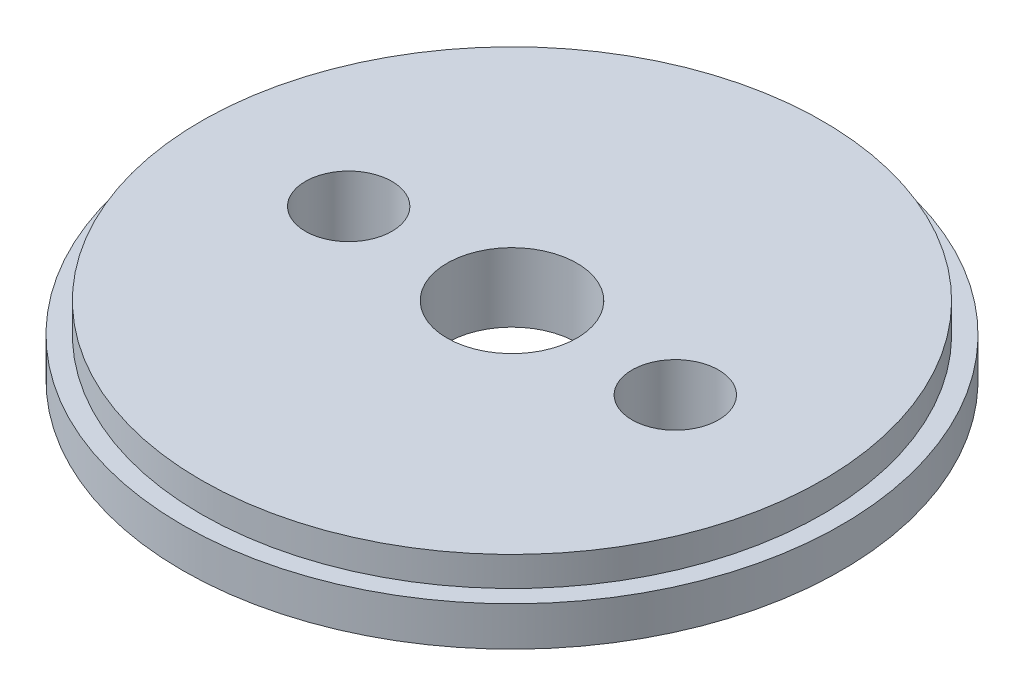
ISO-10303-21;
HEADER;
FILE_DESCRIPTION(('STEP AP214'),'2;1');
FILE_NAME('part.step','',(''),(''),'','','');
FILE_SCHEMA(('AUTOMOTIVE_DESIGN { 1 0 10303 214 1 1 1 1 }'));
ENDSEC;
DATA;
#1=APPLICATION_CONTEXT('core data for automotive mechanical design processes');
#2=APPLICATION_PROTOCOL_DEFINITION('international standard','automotive_design',2000,#1);
#3=PRODUCT_CONTEXT('',#1,'mechanical');
#4=PRODUCT('Part','Part','',(#3));
#5=PRODUCT_RELATED_PRODUCT_CATEGORY('part','',(#4));
#6=PRODUCT_DEFINITION_FORMATION('','',#4);
#7=PRODUCT_DEFINITION_CONTEXT('part definition',#1,'design');
#8=PRODUCT_DEFINITION('design','',#6,#7);
#9=PRODUCT_DEFINITION_SHAPE('','',#8);
#10=(LENGTH_UNIT() NAMED_UNIT(*) SI_UNIT(.MILLI.,.METRE.));
#11=(NAMED_UNIT(*) PLANE_ANGLE_UNIT() SI_UNIT($,.RADIAN.));
#12=(NAMED_UNIT(*) SI_UNIT($,.STERADIAN.) SOLID_ANGLE_UNIT());
#13=UNCERTAINTY_MEASURE_WITH_UNIT(LENGTH_MEASURE(1.E-05),#10,'distance_accuracy_value','');
#14=(GEOMETRIC_REPRESENTATION_CONTEXT(3) GLOBAL_UNCERTAINTY_ASSIGNED_CONTEXT((#13)) GLOBAL_UNIT_ASSIGNED_CONTEXT((#10,
#11,#12)) REPRESENTATION_CONTEXT('',''));
#15=CARTESIAN_POINT('',(0.,0.,0.));
#16=DIRECTION('',(0.,0.,1.));
#17=DIRECTION('',(1.,0.,0.));
#18=AXIS2_PLACEMENT_3D('',#15,#16,#17);
#19=CARTESIAN_POINT('',(0.,0.,0.));
#20=DIRECTION('',(0.,1.,0.));
#21=DIRECTION('',(0.,0.,1.));
#22=AXIS2_PLACEMENT_3D('',#19,#20,#21);
#23=PLANE('',#22);
#24=CARTESIAN_POINT('',(0.,0.,0.));
#25=DIRECTION('',(0.,1.,0.));
#26=DIRECTION('',(0.,0.,1.));
#27=AXIS2_PLACEMENT_3D('',#24,#25,#26);
#28=CIRCLE('',#27,3.3);
#29=CARTESIAN_POINT('',(0.,0.,3.3));
#30=VERTEX_POINT('',#29);
#31=EDGE_CURVE('E60',#30,#30,#28,.T.);
#32=ORIENTED_EDGE('',*,*,#31,.T.);
#33=EDGE_LOOP('',(#32));
#34=FACE_BOUND('',#33,.T.);
#35=CARTESIAN_POINT('',(8.30000000000001,0.,0.));
#36=DIRECTION('',(0.,1.,0.));
#37=DIRECTION('',(0.,0.,1.));
#38=AXIS2_PLACEMENT_3D('',#35,#36,#37);
#39=CIRCLE('',#38,2.2);
#40=CARTESIAN_POINT('',(8.30000000000001,0.,2.2));
#41=VERTEX_POINT('',#40);
#42=EDGE_CURVE('E54',#41,#41,#39,.F.);
#43=ORIENTED_EDGE('',*,*,#42,.F.);
#44=EDGE_LOOP('',(#43));
#45=FACE_BOUND('',#44,.T.);
#46=CARTESIAN_POINT('',(0.,0.,0.));
#47=DIRECTION('',(0.,1.,0.));
#48=DIRECTION('',(0.,0.,1.));
#49=AXIS2_PLACEMENT_3D('',#46,#47,#48);
#50=CIRCLE('',#49,16.75);
#51=CARTESIAN_POINT('',(0.,0.,16.75));
#52=VERTEX_POINT('',#51);
#53=EDGE_CURVE('E11',#52,#52,#50,.T.);
#54=ORIENTED_EDGE('',*,*,#53,.F.);
#55=EDGE_LOOP('',(#54));
#56=FACE_BOUND('',#55,.T.);
#57=CARTESIAN_POINT('',(-8.3,0.,0.));
#58=DIRECTION('',(0.,1.,0.));
#59=DIRECTION('',(0.,0.,1.));
#60=AXIS2_PLACEMENT_3D('',#57,#58,#59);
#61=CIRCLE('',#60,2.2);
#62=CARTESIAN_POINT('',(-8.3,0.,2.2));
#63=VERTEX_POINT('',#62);
#64=EDGE_CURVE('E48',#63,#63,#61,.T.);
#65=ORIENTED_EDGE('',*,*,#64,.T.);
#66=EDGE_LOOP('',(#65));
#67=FACE_BOUND('',#66,.T.);
#68=ADVANCED_FACE('F32',(#34,#45,#56,#67),#23,.F.);
#69=CARTESIAN_POINT('',(0.,3.5,0.));
#70=DIRECTION('',(0.,1.,0.));
#71=DIRECTION('',(0.,0.,1.));
#72=AXIS2_PLACEMENT_3D('',#69,#70,#71);
#73=PLANE('',#72);
#74=CARTESIAN_POINT('',(8.30000000000001,3.5,0.));
#75=DIRECTION('',(0.,1.,0.));
#76=DIRECTION('',(0.,0.,1.));
#77=AXIS2_PLACEMENT_3D('',#74,#75,#76);
#78=CIRCLE('',#77,2.2);
#79=CARTESIAN_POINT('',(8.30000000000001,3.5,2.2));
#80=VERTEX_POINT('',#79);
#81=EDGE_CURVE('E51',#80,#80,#78,.F.);
#82=ORIENTED_EDGE('',*,*,#81,.T.);
#83=EDGE_LOOP('',(#82));
#84=FACE_BOUND('',#83,.T.);
#85=CARTESIAN_POINT('',(0.,3.5,0.));
#86=DIRECTION('',(0.,1.,0.));
#87=DIRECTION('',(0.,0.,1.));
#88=AXIS2_PLACEMENT_3D('',#85,#86,#87);
#89=CIRCLE('',#88,15.8);
#90=CARTESIAN_POINT('',(0.,3.5,15.8));
#91=VERTEX_POINT('',#90);
#92=EDGE_CURVE('E45',#91,#91,#89,.T.);
#93=ORIENTED_EDGE('',*,*,#92,.T.);
#94=EDGE_LOOP('',(#93));
#95=FACE_BOUND('',#94,.T.);
#96=CARTESIAN_POINT('',(0.,3.5,0.));
#97=DIRECTION('',(0.,1.,0.));
#98=DIRECTION('',(0.,0.,1.));
#99=AXIS2_PLACEMENT_3D('',#96,#97,#98);
#100=CIRCLE('',#99,3.3);
#101=CARTESIAN_POINT('',(0.,3.5,3.3));
#102=VERTEX_POINT('',#101);
#103=EDGE_CURVE('E57',#102,#102,#100,.T.);
#104=ORIENTED_EDGE('',*,*,#103,.F.);
#105=EDGE_LOOP('',(#104));
#106=FACE_BOUND('',#105,.T.);
#107=CARTESIAN_POINT('',(-8.3,3.5,0.));
#108=DIRECTION('',(0.,1.,0.));
#109=DIRECTION('',(0.,0.,1.));
#110=AXIS2_PLACEMENT_3D('',#107,#108,#109);
#111=CIRCLE('',#110,2.2);
#112=CARTESIAN_POINT('',(-8.3,3.5,2.2));
#113=VERTEX_POINT('',#112);
#114=EDGE_CURVE('E63',#113,#113,#111,.T.);
#115=ORIENTED_EDGE('',*,*,#114,.F.);
#116=EDGE_LOOP('',(#115));
#117=FACE_BOUND('',#116,.T.);
#118=ADVANCED_FACE('F77',(#84,#95,#106,#117),#73,.T.);
#119=CARTESIAN_POINT('',(0.,3.5,0.));
#120=DIRECTION('',(0.,-1.,0.));
#121=DIRECTION('',(0.,0.,-1.));
#122=AXIS2_PLACEMENT_3D('',#119,#120,#121);
#123=CYLINDRICAL_SURFACE('',#122,16.75);
#124=ORIENTED_EDGE('',*,*,#53,.T.);
#125=EDGE_LOOP('',(#124));
#126=FACE_BOUND('',#125,.T.);
#127=CARTESIAN_POINT('',(0.,2.,0.));
#128=DIRECTION('',(0.,1.,0.));
#129=DIRECTION('',(0.,0.,1.));
#130=AXIS2_PLACEMENT_3D('',#127,#128,#129);
#131=CIRCLE('',#130,16.75);
#132=CARTESIAN_POINT('',(0.,2.,16.75));
#133=VERTEX_POINT('',#132);
#134=EDGE_CURVE('E36',#133,#133,#131,.T.);
#135=ORIENTED_EDGE('',*,*,#134,.F.);
#136=EDGE_LOOP('',(#135));
#137=FACE_BOUND('',#136,.T.);
#138=ADVANCED_FACE('F34',(#126,#137),#123,.T.);
#139=CARTESIAN_POINT('',(0.,2.,0.));
#140=DIRECTION('',(0.,1.,0.));
#141=DIRECTION('',(0.,0.,1.));
#142=AXIS2_PLACEMENT_3D('',#139,#140,#141);
#143=PLANE('',#142);
#144=CARTESIAN_POINT('',(0.,2.,0.));
#145=DIRECTION('',(0.,1.,0.));
#146=DIRECTION('',(0.,0.,1.));
#147=AXIS2_PLACEMENT_3D('',#144,#145,#146);
#148=CIRCLE('',#147,15.8);
#149=CARTESIAN_POINT('',(0.,2.,15.8));
#150=VERTEX_POINT('',#149);
#151=EDGE_CURVE('E43',#150,#150,#148,.T.);
#152=ORIENTED_EDGE('',*,*,#151,.F.);
#153=EDGE_LOOP('',(#152));
#154=FACE_BOUND('',#153,.T.);
#155=ORIENTED_EDGE('',*,*,#134,.T.);
#156=EDGE_LOOP('',(#155));
#157=FACE_BOUND('',#156,.T.);
#158=ADVANCED_FACE('F85',(#154,#157),#143,.T.);
#159=CARTESIAN_POINT('',(0.,2.,0.));
#160=DIRECTION('',(0.,1.,0.));
#161=DIRECTION('',(0.,0.,1.));
#162=AXIS2_PLACEMENT_3D('',#159,#160,#161);
#163=CYLINDRICAL_SURFACE('',#162,15.8);
#164=ORIENTED_EDGE('',*,*,#151,.T.);
#165=EDGE_LOOP('',(#164));
#166=FACE_BOUND('',#165,.T.);
#167=ORIENTED_EDGE('',*,*,#92,.F.);
#168=EDGE_LOOP('',(#167));
#169=FACE_BOUND('',#168,.T.);
#170=ADVANCED_FACE('F91',(#166,#169),#163,.T.);
#171=CARTESIAN_POINT('',(8.30000000000001,0.,0.));
#172=DIRECTION('',(0.,1.,0.));
#173=DIRECTION('',(0.,0.,1.));
#174=AXIS2_PLACEMENT_3D('',#171,#172,#173);
#175=CYLINDRICAL_SURFACE('',#174,2.2);
#176=ORIENTED_EDGE('',*,*,#42,.T.);
#177=EDGE_LOOP('',(#176));
#178=FACE_BOUND('',#177,.T.);
#179=ORIENTED_EDGE('',*,*,#81,.F.);
#180=EDGE_LOOP('',(#179));
#181=FACE_BOUND('',#180,.T.);
#182=ADVANCED_FACE('F95',(#178,#181),#175,.F.);
#183=CARTESIAN_POINT('',(0.,0.,0.));
#184=DIRECTION('',(0.,1.,0.));
#185=DIRECTION('',(0.,0.,1.));
#186=AXIS2_PLACEMENT_3D('',#183,#184,#185);
#187=CYLINDRICAL_SURFACE('',#186,3.3);
#188=ORIENTED_EDGE('',*,*,#31,.F.);
#189=EDGE_LOOP('',(#188));
#190=FACE_BOUND('',#189,.T.);
#191=ORIENTED_EDGE('',*,*,#103,.T.);
#192=EDGE_LOOP('',(#191));
#193=FACE_BOUND('',#192,.T.);
#194=ADVANCED_FACE('F73',(#190,#193),#187,.F.);
#195=CARTESIAN_POINT('',(-8.3,0.,0.));
#196=DIRECTION('',(0.,1.,0.));
#197=DIRECTION('',(0.,0.,1.));
#198=AXIS2_PLACEMENT_3D('',#195,#196,#197);
#199=CYLINDRICAL_SURFACE('',#198,2.2);
#200=ORIENTED_EDGE('',*,*,#64,.F.);
#201=EDGE_LOOP('',(#200));
#202=FACE_BOUND('',#201,.T.);
#203=ORIENTED_EDGE('',*,*,#114,.T.);
#204=EDGE_LOOP('',(#203));
#205=FACE_BOUND('',#204,.T.);
#206=ADVANCED_FACE('F70',(#202,#205),#199,.F.);
#207=CLOSED_SHELL('',(#68,#118,#138,#158,#170,#182,#194,#206));
#208=MANIFOLD_SOLID_BREP('B2',#207);
#209=ADVANCED_BREP_SHAPE_REPRESENTATION('',(#18,#208),#14);
#210=SHAPE_DEFINITION_REPRESENTATION(#9,#209);
ENDSEC;
END-ISO-10303-21;
